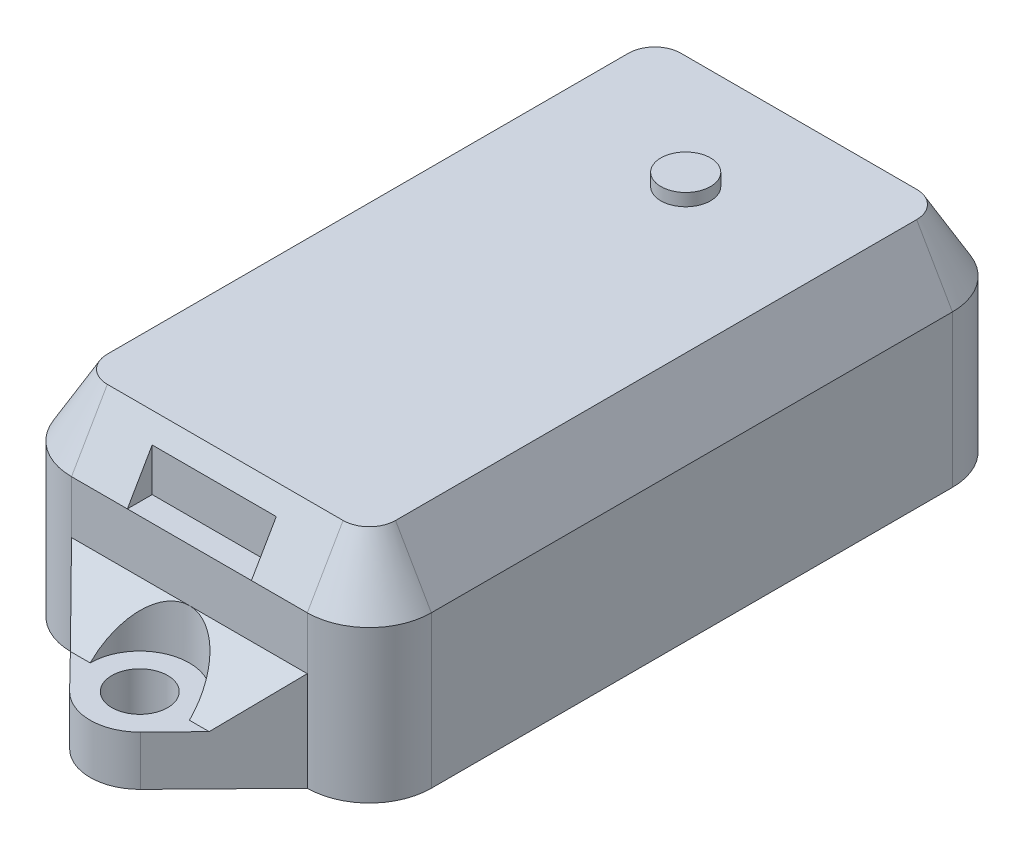
ISO-10303-21;
HEADER;
FILE_DESCRIPTION(('STEP AP214'),'2;1');
FILE_NAME('part.step','',(''),(''),'','','');
FILE_SCHEMA(('AUTOMOTIVE_DESIGN { 1 0 10303 214 1 1 1 1 }'));
ENDSEC;
DATA;
#1=APPLICATION_CONTEXT('core data for automotive mechanical design processes');
#2=APPLICATION_PROTOCOL_DEFINITION('international standard','automotive_design',2000,#1);
#3=PRODUCT_CONTEXT('',#1,'mechanical');
#4=PRODUCT('Part','Part','',(#3));
#5=PRODUCT_RELATED_PRODUCT_CATEGORY('part','',(#4));
#6=PRODUCT_DEFINITION_FORMATION('','',#4);
#7=PRODUCT_DEFINITION_CONTEXT('part definition',#1,'design');
#8=PRODUCT_DEFINITION('design','',#6,#7);
#9=PRODUCT_DEFINITION_SHAPE('','',#8);
#10=(LENGTH_UNIT() NAMED_UNIT(*) SI_UNIT(.MILLI.,.METRE.));
#11=(NAMED_UNIT(*) PLANE_ANGLE_UNIT() SI_UNIT($,.RADIAN.));
#12=(NAMED_UNIT(*) SI_UNIT($,.STERADIAN.) SOLID_ANGLE_UNIT());
#13=UNCERTAINTY_MEASURE_WITH_UNIT(LENGTH_MEASURE(1.E-05),#10,'distance_accuracy_value','');
#14=(GEOMETRIC_REPRESENTATION_CONTEXT(3) GLOBAL_UNCERTAINTY_ASSIGNED_CONTEXT((#13)) GLOBAL_UNIT_ASSIGNED_CONTEXT((#10,
#11,#12)) REPRESENTATION_CONTEXT('',''));
#15=CARTESIAN_POINT('',(0.,0.,0.));
#16=DIRECTION('',(0.,0.,1.));
#17=DIRECTION('',(1.,0.,0.));
#18=AXIS2_PLACEMENT_3D('',#15,#16,#17);
#19=CARTESIAN_POINT('',(14.5,4.,4.));
#20=DIRECTION('',(0.,-1.,0.));
#21=DIRECTION('',(0.,0.,-1.));
#22=AXIS2_PLACEMENT_3D('',#19,#20,#21);
#23=CYLINDRICAL_SURFACE('',#22,2.25);
#24=CARTESIAN_POINT('',(14.5,0.,4.));
#25=DIRECTION('',(0.,1.,0.));
#26=DIRECTION('',(0.,0.,1.));
#27=AXIS2_PLACEMENT_3D('',#24,#25,#26);
#28=CIRCLE('',#27,2.25);
#29=CARTESIAN_POINT('',(14.5,0.,6.25));
#30=VERTEX_POINT('',#29);
#31=EDGE_CURVE('E358',#30,#30,#28,.T.);
#32=ORIENTED_EDGE('',*,*,#31,.F.);
#33=EDGE_LOOP('',(#32));
#34=FACE_BOUND('',#33,.T.);
#35=CARTESIAN_POINT('',(14.5,4.,4.));
#36=DIRECTION('',(0.,1.,0.));
#37=DIRECTION('',(0.,0.,1.));
#38=AXIS2_PLACEMENT_3D('',#35,#36,#37);
#39=CIRCLE('',#38,2.25);
#40=CARTESIAN_POINT('',(14.5,4.,6.25));
#41=VERTEX_POINT('',#40);
#42=EDGE_CURVE('E402',#41,#41,#39,.T.);
#43=ORIENTED_EDGE('',*,*,#42,.T.);
#44=EDGE_LOOP('',(#43));
#45=FACE_BOUND('',#44,.T.);
#46=ADVANCED_FACE('F53',(#34,#45),#23,.F.);
#47=CARTESIAN_POINT('',(24.,7.99999999999997,0.));
#48=DIRECTION('',(0.,-0.707106781186548,-0.707106781186548));
#49=DIRECTION('',(0.,0.707106781186548,-0.707106781186548));
#50=AXIS2_PLACEMENT_3D('',#47,#48,#49);
#51=PLANE('',#50);
#52=CARTESIAN_POINT('',(14.5,3.99999999999997,4.));
#53=DIRECTION('',(0.,-0.707106781186548,-0.707106781186548));
#54=DIRECTION('',(0.,-0.707106781186548,0.707106781186548));
#55=AXIS2_PLACEMENT_3D('',#52,#53,#54);
#56=ELLIPSE('',#55,5.65685424949238,4.);
#57=CARTESIAN_POINT('',(18.5,4.,3.99999999999997));
#58=VERTEX_POINT('',#57);
#59=CARTESIAN_POINT('',(14.5,7.99999999999997,0.));
#60=VERTEX_POINT('',#59);
#61=EDGE_CURVE('E384',#58,#60,#56,.F.);
#62=ORIENTED_EDGE('',*,*,#61,.F.);
#63=DIRECTION('',(1.,0.,0.));
#64=VECTOR('',#63,1.);
#65=CARTESIAN_POINT('',(16.75,4.,4.));
#66=LINE('',#65,#64);
#67=CARTESIAN_POINT('',(20.0921052631579,3.99999999999997,4.));
#68=VERTEX_POINT('',#67);
#69=EDGE_CURVE('E398',#58,#68,#66,.T.);
#70=ORIENTED_EDGE('',*,*,#69,.T.);
#71=DIRECTION('',(0.568384879932056,0.581781156563455,-0.581781156563455));
#72=VECTOR('',#71,1.);
#73=CARTESIAN_POINT('',(14.9238246270707,-1.2900919642105,9.29009196421047));
#74=LINE('',#73,#72);
#75=CARTESIAN_POINT('',(24.,8.,0.));
#76=VERTEX_POINT('',#75);
#77=EDGE_CURVE('E547',#68,#76,#74,.T.);
#78=ORIENTED_EDGE('',*,*,#77,.T.);
#79=DIRECTION('',(-1.,0.,0.));
#80=VECTOR('',#79,1.);
#81=CARTESIAN_POINT('',(24.,8.,0.));
#82=LINE('',#81,#80);
#83=EDGE_CURVE('E551',#76,#60,#82,.T.);
#84=ORIENTED_EDGE('',*,*,#83,.T.);
#85=EDGE_LOOP('',(#62,#70,#78,#84));
#86=FACE_BOUND('',#85,.T.);
#87=ADVANCED_FACE('F562',(#86),#51,.F.);
#88=CARTESIAN_POINT('',(10.5,4.,3.99999999999997));
#89=VERTEX_POINT('',#88);
#90=EDGE_CURVE('E948',#60,#89,#56,.F.);
#91=ORIENTED_EDGE('',*,*,#90,.F.);
#92=CARTESIAN_POINT('',(5.00000000000006,7.99999999999997,0.));
#93=VERTEX_POINT('',#92);
#94=EDGE_CURVE('E546',#60,#93,#82,.T.);
#95=ORIENTED_EDGE('',*,*,#94,.T.);
#96=DIRECTION('',(-0.568384879932056,0.581781156563455,-0.581781156563455));
#97=VECTOR('',#96,1.);
#98=CARTESIAN_POINT('',(4.70739559260333,8.29950080757101,-0.299500807571039));
#99=LINE('',#98,#97);
#100=CARTESIAN_POINT('',(8.90789473684214,3.99999999999997,4.));
#101=VERTEX_POINT('',#100);
#102=EDGE_CURVE('E542',#101,#93,#99,.T.);
#103=ORIENTED_EDGE('',*,*,#102,.F.);
#104=DIRECTION('',(1.,0.,0.));
#105=VECTOR('',#104,1.);
#106=CARTESIAN_POINT('',(8.90789473684214,4.,4.00000000000001));
#107=LINE('',#106,#105);
#108=EDGE_CURVE('E392',#101,#89,#107,.T.);
#109=ORIENTED_EDGE('',*,*,#108,.T.);
#110=EDGE_LOOP('',(#91,#95,#103,#109));
#111=FACE_BOUND('',#110,.T.);
#112=ADVANCED_FACE('F657',(#111),#51,.F.);
#113=CARTESIAN_POINT('',(14.5,4.,-56.));
#114=DIRECTION('',(0.,-1.,0.));
#115=DIRECTION('',(0.,0.,-1.));
#116=AXIS2_PLACEMENT_3D('',#113,#114,#115);
#117=CYLINDRICAL_SURFACE('',#116,2.25);
#118=CARTESIAN_POINT('',(14.5,0.,-56.));
#119=DIRECTION('',(0.,1.,0.));
#120=DIRECTION('',(0.,0.,1.));
#121=AXIS2_PLACEMENT_3D('',#118,#119,#120);
#122=CIRCLE('',#121,2.25);
#123=CARTESIAN_POINT('',(14.5,0.,-53.75));
#124=VERTEX_POINT('',#123);
#125=EDGE_CURVE('E451',#124,#124,#122,.F.);
#126=ORIENTED_EDGE('',*,*,#125,.T.);
#127=EDGE_LOOP('',(#126));
#128=FACE_BOUND('',#127,.T.);
#129=CARTESIAN_POINT('',(14.5,4.,-56.));
#130=DIRECTION('',(0.,1.,0.));
#131=DIRECTION('',(0.,0.,1.));
#132=AXIS2_PLACEMENT_3D('',#129,#130,#131);
#133=CIRCLE('',#132,2.25);
#134=CARTESIAN_POINT('',(14.5,4.,-53.75));
#135=VERTEX_POINT('',#134);
#136=EDGE_CURVE('E456',#135,#135,#133,.F.);
#137=ORIENTED_EDGE('',*,*,#136,.F.);
#138=EDGE_LOOP('',(#137));
#139=FACE_BOUND('',#138,.T.);
#140=ADVANCED_FACE('F667',(#128,#139),#117,.F.);
#141=CARTESIAN_POINT('',(0.,17.25,0.));
#142=DIRECTION('',(0.,0.,-1.));
#143=DIRECTION('',(-1.,0.,0.));
#144=AXIS2_PLACEMENT_3D('',#141,#142,#143);
#145=PLANE('',#144);
#146=ORIENTED_EDGE('',*,*,#94,.F.);
#147=ORIENTED_EDGE('',*,*,#83,.F.);
#148=DIRECTION('',(0.,-1.,0.));
#149=VECTOR('',#148,1.);
#150=CARTESIAN_POINT('',(24.,17.25,0.));
#151=LINE('',#150,#149);
#152=CARTESIAN_POINT('',(24.,12.25,0.));
#153=VERTEX_POINT('',#152);
#154=EDGE_CURVE('E505',#153,#76,#151,.T.);
#155=ORIENTED_EDGE('',*,*,#154,.F.);
#156=DIRECTION('',(-1.,0.,0.));
#157=VECTOR('',#156,1.);
#158=CARTESIAN_POINT('',(5.00000000000004,12.25,0.));
#159=LINE('',#158,#157);
#160=CARTESIAN_POINT('',(19.5,12.25,0.));
#161=VERTEX_POINT('',#160);
#162=EDGE_CURVE('E307',#153,#161,#159,.T.);
#163=ORIENTED_EDGE('',*,*,#162,.T.);
#164=DIRECTION('',(1.,0.,0.));
#165=VECTOR('',#164,1.);
#166=CARTESIAN_POINT('',(9.50000000000004,12.25,0.));
#167=LINE('',#166,#165);
#168=CARTESIAN_POINT('',(9.50000000000004,12.25,0.));
#169=VERTEX_POINT('',#168);
#170=EDGE_CURVE('E597',#169,#161,#167,.T.);
#171=ORIENTED_EDGE('',*,*,#170,.F.);
#172=CARTESIAN_POINT('',(5.00000000000004,12.25,0.));
#173=VERTEX_POINT('',#172);
#174=EDGE_CURVE('E306',#169,#173,#159,.T.);
#175=ORIENTED_EDGE('',*,*,#174,.T.);
#176=DIRECTION('',(0.,-1.,0.));
#177=VECTOR('',#176,1.);
#178=CARTESIAN_POINT('',(5.00000000000004,17.25,0.));
#179=LINE('',#178,#177);
#180=EDGE_CURVE('E509',#173,#93,#179,.T.);
#181=ORIENTED_EDGE('',*,*,#180,.T.);
#182=EDGE_LOOP('',(#146,#147,#155,#163,#171,#175,#181));
#183=FACE_BOUND('',#182,.T.);
#184=ADVANCED_FACE('F569',(#183),#145,.F.);
#185=CARTESIAN_POINT('',(0.,4.,0.));
#186=DIRECTION('',(0.,1.,0.));
#187=DIRECTION('',(0.,0.,1.));
#188=AXIS2_PLACEMENT_3D('',#185,#186,#187);
#189=PLANE('',#188);
#190=ORIENTED_EDGE('',*,*,#42,.F.);
#191=EDGE_LOOP('',(#190));
#192=FACE_BOUND('',#191,.T.);
#193=CARTESIAN_POINT('',(14.5,4.,4.));
#194=DIRECTION('',(0.,1.,0.));
#195=DIRECTION('',(0.,0.,1.));
#196=AXIS2_PLACEMENT_3D('',#193,#194,#195);
#197=CIRCLE('',#196,4.);
#198=EDGE_CURVE('E946',#58,#89,#197,.T.);
#199=ORIENTED_EDGE('',*,*,#198,.T.);
#200=ORIENTED_EDGE('',*,*,#108,.F.);
#201=DIRECTION('',(0.698823529411763,0.,0.715294117647061));
#202=VECTOR('',#201,1.);
#203=CARTESIAN_POINT('',(2.55822837370245,4.,-2.49932179930798));
#204=LINE('',#203,#202);
#205=CARTESIAN_POINT('',(11.6388235294118,4.,6.79529411764705));
#206=VERTEX_POINT('',#205);
#207=EDGE_CURVE('E406',#101,#206,#204,.T.);
#208=ORIENTED_EDGE('',*,*,#207,.T.);
#209=CARTESIAN_POINT('',(14.5,4.,4.));
#210=DIRECTION('',(0.,1.,0.));
#211=DIRECTION('',(0.,0.,1.));
#212=AXIS2_PLACEMENT_3D('',#209,#210,#211);
#213=CIRCLE('',#212,4.);
#214=CARTESIAN_POINT('',(17.3611764705882,4.,6.79529411764706));
#215=VERTEX_POINT('',#214);
#216=EDGE_CURVE('E410',#206,#215,#213,.T.);
#217=ORIENTED_EDGE('',*,*,#216,.T.);
#218=DIRECTION('',(-0.698823529411763,0.,0.715294117647061));
#219=VECTOR('',#218,1.);
#220=CARTESIAN_POINT('',(12.2794961937717,4.,11.9967446366782));
#221=LINE('',#220,#219);
#222=EDGE_CURVE('E414',#68,#215,#221,.T.);
#223=ORIENTED_EDGE('',*,*,#222,.F.);
#224=ORIENTED_EDGE('',*,*,#69,.F.);
#225=EDGE_LOOP('',(#199,#200,#208,#217,#223,#224));
#226=FACE_BOUND('',#225,.T.);
#227=ADVANCED_FACE('F722',(#192,#226),#189,.T.);
#228=CARTESIAN_POINT('',(29.,17.25,0.));
#229=DIRECTION('',(-1.,0.,0.));
#230=DIRECTION('',(0.,0.,1.));
#231=AXIS2_PLACEMENT_3D('',#228,#229,#230);
#232=PLANE('',#231);
#233=DIRECTION('',(0.,-1.,0.));
#234=VECTOR('',#233,1.);
#235=CARTESIAN_POINT('',(29.,17.25,-47.));
#236=LINE('',#235,#234);
#237=CARTESIAN_POINT('',(29.,12.25,-47.));
#238=VERTEX_POINT('',#237);
#239=CARTESIAN_POINT('',(29.,0.,-47.));
#240=VERTEX_POINT('',#239);
#241=EDGE_CURVE('E266',#238,#240,#236,.T.);
#242=ORIENTED_EDGE('',*,*,#241,.F.);
#243=DIRECTION('',(0.,0.,1.));
#244=VECTOR('',#243,1.);
#245=CARTESIAN_POINT('',(29.,12.25,-5.00000000000004));
#246=LINE('',#245,#244);
#247=CARTESIAN_POINT('',(29.,12.25,-5.00000000000004));
#248=VERTEX_POINT('',#247);
#249=EDGE_CURVE('E325',#238,#248,#246,.T.);
#250=ORIENTED_EDGE('',*,*,#249,.T.);
#251=DIRECTION('',(0.,-1.,0.));
#252=VECTOR('',#251,1.);
#253=CARTESIAN_POINT('',(29.,17.25,-5.00000000000004));
#254=LINE('',#253,#252);
#255=CARTESIAN_POINT('',(29.,0.,-5.00000000000004));
#256=VERTEX_POINT('',#255);
#257=EDGE_CURVE('E502',#248,#256,#254,.T.);
#258=ORIENTED_EDGE('',*,*,#257,.T.);
#259=DIRECTION('',(0.,0.,-1.));
#260=VECTOR('',#259,1.);
#261=CARTESIAN_POINT('',(29.,0.,0.));
#262=LINE('',#261,#260);
#263=EDGE_CURVE('E481',#256,#240,#262,.T.);
#264=ORIENTED_EDGE('',*,*,#263,.T.);
#265=EDGE_LOOP('',(#242,#250,#258,#264));
#266=FACE_BOUND('',#265,.T.);
#267=ADVANCED_FACE('F726',(#266),#232,.F.);
#268=CARTESIAN_POINT('',(24.,17.25,-47.));
#269=DIRECTION('',(0.,-1.,0.));
#270=DIRECTION('',(0.,0.,-1.));
#271=AXIS2_PLACEMENT_3D('',#268,#269,#270);
#272=CYLINDRICAL_SURFACE('',#271,5.);
#273=DIRECTION('',(0.,-1.,0.));
#274=VECTOR('',#273,1.);
#275=CARTESIAN_POINT('',(24.,17.25,-52.));
#276=LINE('',#275,#274);
#277=CARTESIAN_POINT('',(24.,12.25,-52.));
#278=VERTEX_POINT('',#277);
#279=CARTESIAN_POINT('',(24.,8.,-52.));
#280=VERTEX_POINT('',#279);
#281=EDGE_CURVE('E253',#278,#280,#276,.T.);
#282=ORIENTED_EDGE('',*,*,#281,.F.);
#283=CARTESIAN_POINT('',(24.,12.25,-47.));
#284=DIRECTION('',(0.,1.,0.));
#285=DIRECTION('',(0.,0.,1.));
#286=AXIS2_PLACEMENT_3D('',#283,#284,#285);
#287=CIRCLE('',#286,5.);
#288=EDGE_CURVE('E322',#278,#238,#287,.F.);
#289=ORIENTED_EDGE('',*,*,#288,.T.);
#290=ORIENTED_EDGE('',*,*,#241,.T.);
#291=CARTESIAN_POINT('',(24.,0.,-47.));
#292=DIRECTION('',(0.,1.,0.));
#293=DIRECTION('',(0.,0.,1.));
#294=AXIS2_PLACEMENT_3D('',#291,#292,#293);
#295=CIRCLE('',#294,5.);
#296=CARTESIAN_POINT('',(24.,0.,-52.));
#297=VERTEX_POINT('',#296);
#298=EDGE_CURVE('E256',#297,#240,#295,.F.);
#299=ORIENTED_EDGE('',*,*,#298,.F.);
#300=DIRECTION('',(0.,-1.,0.));
#301=VECTOR('',#300,1.);
#302=CARTESIAN_POINT('',(24.,4.,-52.));
#303=LINE('',#302,#301);
#304=EDGE_CURVE('E243',#280,#297,#303,.T.);
#305=ORIENTED_EDGE('',*,*,#304,.F.);
#306=EDGE_LOOP('',(#282,#289,#290,#299,#305));
#307=FACE_BOUND('',#306,.T.);
#308=ADVANCED_FACE('F252',(#307),#272,.T.);
#309=CARTESIAN_POINT('',(0.,17.25,-52.));
#310=DIRECTION('',(0.,0.,-1.));
#311=DIRECTION('',(-1.,0.,0.));
#312=AXIS2_PLACEMENT_3D('',#309,#310,#311);
#313=PLANE('',#312);
#314=DIRECTION('',(1.,0.,0.));
#315=VECTOR('',#314,1.);
#316=CARTESIAN_POINT('',(0.,12.25,-52.));
#317=LINE('',#316,#315);
#318=CARTESIAN_POINT('',(5.00000000000004,12.25,-52.));
#319=VERTEX_POINT('',#318);
#320=EDGE_CURVE('E264',#319,#278,#317,.T.);
#321=ORIENTED_EDGE('',*,*,#320,.T.);
#322=ORIENTED_EDGE('',*,*,#281,.T.);
#323=DIRECTION('',(-1.,0.,0.));
#324=VECTOR('',#323,1.);
#325=CARTESIAN_POINT('',(24.,8.,-52.));
#326=LINE('',#325,#324);
#327=CARTESIAN_POINT('',(14.5,8.,-52.));
#328=VERTEX_POINT('',#327);
#329=EDGE_CURVE('E225',#280,#328,#326,.T.);
#330=ORIENTED_EDGE('',*,*,#329,.T.);
#331=CARTESIAN_POINT('',(5.00000000000006,8.,-52.));
#332=VERTEX_POINT('',#331);
#333=EDGE_CURVE('E235',#328,#332,#326,.T.);
#334=ORIENTED_EDGE('',*,*,#333,.T.);
#335=DIRECTION('',(0.,-1.,0.));
#336=VECTOR('',#335,1.);
#337=CARTESIAN_POINT('',(5.00000000000004,17.25,-52.));
#338=LINE('',#337,#336);
#339=EDGE_CURVE('E267',#319,#332,#338,.T.);
#340=ORIENTED_EDGE('',*,*,#339,.F.);
#341=EDGE_LOOP('',(#321,#322,#330,#334,#340));
#342=FACE_BOUND('',#341,.T.);
#343=ADVANCED_FACE('F261',(#342),#313,.T.);
#344=CARTESIAN_POINT('',(5.,17.25,-47.));
#345=DIRECTION('',(0.,-1.,0.));
#346=DIRECTION('',(0.,0.,-1.));
#347=AXIS2_PLACEMENT_3D('',#344,#345,#346);
#348=CYLINDRICAL_SURFACE('',#347,5.);
#349=DIRECTION('',(0.,-1.,0.));
#350=VECTOR('',#349,1.);
#351=CARTESIAN_POINT('',(0.,17.25,-47.));
#352=LINE('',#351,#350);
#353=CARTESIAN_POINT('',(0.,12.25,-47.));
#354=VERTEX_POINT('',#353);
#355=CARTESIAN_POINT('',(0.,0.,-47.));
#356=VERTEX_POINT('',#355);
#357=EDGE_CURVE('E274',#354,#356,#352,.T.);
#358=ORIENTED_EDGE('',*,*,#357,.F.);
#359=CARTESIAN_POINT('',(5.,12.25,-47.));
#360=DIRECTION('',(0.,1.,0.));
#361=DIRECTION('',(0.,0.,1.));
#362=AXIS2_PLACEMENT_3D('',#359,#360,#361);
#363=CIRCLE('',#362,5.);
#364=EDGE_CURVE('E317',#354,#319,#363,.F.);
#365=ORIENTED_EDGE('',*,*,#364,.T.);
#366=ORIENTED_EDGE('',*,*,#339,.T.);
#367=DIRECTION('',(0.,-1.,0.));
#368=VECTOR('',#367,1.);
#369=CARTESIAN_POINT('',(5.00000000000004,4.,-52.));
#370=LINE('',#369,#368);
#371=CARTESIAN_POINT('',(5.00000000000004,0.,-52.));
#372=VERTEX_POINT('',#371);
#373=EDGE_CURVE('E258',#332,#372,#370,.T.);
#374=ORIENTED_EDGE('',*,*,#373,.T.);
#375=CARTESIAN_POINT('',(5.,0.,-47.));
#376=DIRECTION('',(0.,1.,0.));
#377=DIRECTION('',(0.,0.,1.));
#378=AXIS2_PLACEMENT_3D('',#375,#376,#377);
#379=CIRCLE('',#378,5.);
#380=EDGE_CURVE('E487',#356,#372,#379,.F.);
#381=ORIENTED_EDGE('',*,*,#380,.F.);
#382=EDGE_LOOP('',(#358,#365,#366,#374,#381));
#383=FACE_BOUND('',#382,.T.);
#384=ADVANCED_FACE('F525',(#383),#348,.T.);
#385=CARTESIAN_POINT('',(0.,17.25,0.));
#386=DIRECTION('',(-1.,0.,0.));
#387=DIRECTION('',(0.,0.,1.));
#388=AXIS2_PLACEMENT_3D('',#385,#386,#387);
#389=PLANE('',#388);
#390=DIRECTION('',(0.,-1.,0.));
#391=VECTOR('',#390,1.);
#392=CARTESIAN_POINT('',(0.,17.25,-5.00000000000004));
#393=LINE('',#392,#391);
#394=CARTESIAN_POINT('',(0.,12.25,-5.00000000000004));
#395=VERTEX_POINT('',#394);
#396=CARTESIAN_POINT('',(0.,0.,-5.00000000000004));
#397=VERTEX_POINT('',#396);
#398=EDGE_CURVE('E513',#395,#397,#393,.T.);
#399=ORIENTED_EDGE('',*,*,#398,.F.);
#400=DIRECTION('',(0.,0.,-1.));
#401=VECTOR('',#400,1.);
#402=CARTESIAN_POINT('',(0.,12.25,0.));
#403=LINE('',#402,#401);
#404=EDGE_CURVE('E314',#395,#354,#403,.T.);
#405=ORIENTED_EDGE('',*,*,#404,.T.);
#406=ORIENTED_EDGE('',*,*,#357,.T.);
#407=DIRECTION('',(0.,0.,-1.));
#408=VECTOR('',#407,1.);
#409=CARTESIAN_POINT('',(0.,0.,0.));
#410=LINE('',#409,#408);
#411=EDGE_CURVE('E491',#397,#356,#410,.T.);
#412=ORIENTED_EDGE('',*,*,#411,.F.);
#413=EDGE_LOOP('',(#399,#405,#406,#412));
#414=FACE_BOUND('',#413,.T.);
#415=ADVANCED_FACE('F521',(#414),#389,.T.);
#416=CARTESIAN_POINT('',(5.,17.25,-5.));
#417=DIRECTION('',(0.,-1.,0.));
#418=DIRECTION('',(0.,0.,-1.));
#419=AXIS2_PLACEMENT_3D('',#416,#417,#418);
#420=CYLINDRICAL_SURFACE('',#419,5.);
#421=ORIENTED_EDGE('',*,*,#180,.F.);
#422=CARTESIAN_POINT('',(5.,12.25,-5.));
#423=DIRECTION('',(0.,1.,0.));
#424=DIRECTION('',(0.,0.,1.));
#425=AXIS2_PLACEMENT_3D('',#422,#423,#424);
#426=CIRCLE('',#425,5.);
#427=EDGE_CURVE('E311',#173,#395,#426,.F.);
#428=ORIENTED_EDGE('',*,*,#427,.T.);
#429=ORIENTED_EDGE('',*,*,#398,.T.);
#430=CARTESIAN_POINT('',(5.,0.,-5.));
#431=DIRECTION('',(0.,1.,0.));
#432=DIRECTION('',(0.,0.,1.));
#433=AXIS2_PLACEMENT_3D('',#430,#431,#432);
#434=CIRCLE('',#433,5.);
#435=CARTESIAN_POINT('',(5.00000000000004,0.,0.));
#436=VERTEX_POINT('',#435);
#437=EDGE_CURVE('E495',#397,#436,#434,.T.);
#438=ORIENTED_EDGE('',*,*,#437,.T.);
#439=DIRECTION('',(0.,-1.,0.));
#440=VECTOR('',#439,1.);
#441=CARTESIAN_POINT('',(5.00000000000004,4.,0.));
#442=LINE('',#441,#440);
#443=EDGE_CURVE('E417',#93,#436,#442,.T.);
#444=ORIENTED_EDGE('',*,*,#443,.F.);
#445=EDGE_LOOP('',(#421,#428,#429,#438,#444));
#446=FACE_BOUND('',#445,.T.);
#447=ADVANCED_FACE('F536',(#446),#420,.T.);
#448=CARTESIAN_POINT('',(24.,17.25,-5.));
#449=DIRECTION('',(0.,-1.,0.));
#450=DIRECTION('',(0.,0.,-1.));
#451=AXIS2_PLACEMENT_3D('',#448,#449,#450);
#452=CYLINDRICAL_SURFACE('',#451,5.);
#453=ORIENTED_EDGE('',*,*,#257,.F.);
#454=CARTESIAN_POINT('',(24.,12.25,-5.));
#455=DIRECTION('',(0.,1.,0.));
#456=DIRECTION('',(0.,0.,1.));
#457=AXIS2_PLACEMENT_3D('',#454,#455,#456);
#458=CIRCLE('',#457,5.);
#459=EDGE_CURVE('E302',#248,#153,#458,.F.);
#460=ORIENTED_EDGE('',*,*,#459,.T.);
#461=ORIENTED_EDGE('',*,*,#154,.T.);
#462=DIRECTION('',(0.,-1.,0.));
#463=VECTOR('',#462,1.);
#464=CARTESIAN_POINT('',(24.,4.,0.));
#465=LINE('',#464,#463);
#466=CARTESIAN_POINT('',(24.,0.,0.));
#467=VERTEX_POINT('',#466);
#468=EDGE_CURVE('E435',#76,#467,#465,.T.);
#469=ORIENTED_EDGE('',*,*,#468,.T.);
#470=CARTESIAN_POINT('',(24.,0.,-5.));
#471=DIRECTION('',(0.,1.,0.));
#472=DIRECTION('',(0.,0.,1.));
#473=AXIS2_PLACEMENT_3D('',#470,#471,#472);
#474=CIRCLE('',#473,5.);
#475=EDGE_CURVE('E498',#467,#256,#474,.T.);
#476=ORIENTED_EDGE('',*,*,#475,.T.);
#477=EDGE_LOOP('',(#453,#460,#461,#469,#476));
#478=FACE_BOUND('',#477,.T.);
#479=ADVANCED_FACE('F572',(#478),#452,.T.);
#480=CARTESIAN_POINT('',(0.,17.25,0.));
#481=DIRECTION('',(0.,1.,0.));
#482=DIRECTION('',(0.,0.,1.));
#483=AXIS2_PLACEMENT_3D('',#480,#481,#482);
#484=PLANE('',#483);
#485=CARTESIAN_POINT('',(14.5,17.25,-40.));
#486=DIRECTION('',(0.,1.,0.));
#487=DIRECTION('',(0.,0.,1.));
#488=AXIS2_PLACEMENT_3D('',#485,#486,#487);
#489=CIRCLE('',#488,2.00000000000001);
#490=CARTESIAN_POINT('',(14.5,17.25,-38.));
#491=VERTEX_POINT('',#490);
#492=EDGE_CURVE('E383',#491,#491,#489,.T.);
#493=ORIENTED_EDGE('',*,*,#492,.F.);
#494=EDGE_LOOP('',(#493));
#495=FACE_BOUND('',#494,.T.);
#496=DIRECTION('',(1.,0.,0.));
#497=VECTOR('',#496,1.);
#498=CARTESIAN_POINT('',(24.,17.25,-2.88675134594812));
#499=LINE('',#498,#497);
#500=CARTESIAN_POINT('',(5.00000000000004,17.25,-2.88675134594812));
#501=VERTEX_POINT('',#500);
#502=CARTESIAN_POINT('',(24.,17.25,-2.88675134594812));
#503=VERTEX_POINT('',#502);
#504=EDGE_CURVE('E295',#501,#503,#499,.T.);
#505=ORIENTED_EDGE('',*,*,#504,.T.);
#506=CARTESIAN_POINT('',(24.,17.25,-5.));
#507=DIRECTION('',(0.,1.,0.));
#508=DIRECTION('',(0.,0.,1.));
#509=AXIS2_PLACEMENT_3D('',#506,#507,#508);
#510=CIRCLE('',#509,2.11324865405188);
#511=CARTESIAN_POINT('',(26.1132486540519,17.25,-5.00000000000002));
#512=VERTEX_POINT('',#511);
#513=EDGE_CURVE('E298',#503,#512,#510,.T.);
#514=ORIENTED_EDGE('',*,*,#513,.T.);
#515=DIRECTION('',(0.,0.,-1.));
#516=VECTOR('',#515,1.);
#517=CARTESIAN_POINT('',(26.1132486540519,17.25,-47.));
#518=LINE('',#517,#516);
#519=CARTESIAN_POINT('',(26.1132486540519,17.25,-47.));
#520=VERTEX_POINT('',#519);
#521=EDGE_CURVE('E271',#512,#520,#518,.T.);
#522=ORIENTED_EDGE('',*,*,#521,.T.);
#523=CARTESIAN_POINT('',(24.,17.25,-47.));
#524=DIRECTION('',(0.,1.,0.));
#525=DIRECTION('',(0.,0.,1.));
#526=AXIS2_PLACEMENT_3D('',#523,#524,#525);
#527=CIRCLE('',#526,2.11324865405189);
#528=CARTESIAN_POINT('',(24.,17.25,-49.1132486540519));
#529=VERTEX_POINT('',#528);
#530=EDGE_CURVE('E280',#520,#529,#527,.T.);
#531=ORIENTED_EDGE('',*,*,#530,.T.);
#532=DIRECTION('',(-1.,0.,0.));
#533=VECTOR('',#532,1.);
#534=CARTESIAN_POINT('',(0.,17.25,-49.1132486540519));
#535=LINE('',#534,#533);
#536=CARTESIAN_POINT('',(5.00000000000002,17.25,-49.1132486540519));
#537=VERTEX_POINT('',#536);
#538=EDGE_CURVE('E283',#529,#537,#535,.T.);
#539=ORIENTED_EDGE('',*,*,#538,.T.);
#540=CARTESIAN_POINT('',(5.,17.25,-47.));
#541=DIRECTION('',(0.,1.,0.));
#542=DIRECTION('',(0.,0.,1.));
#543=AXIS2_PLACEMENT_3D('',#540,#541,#542);
#544=CIRCLE('',#543,2.11324865405188);
#545=CARTESIAN_POINT('',(2.88675134594811,17.25,-47.));
#546=VERTEX_POINT('',#545);
#547=EDGE_CURVE('E286',#537,#546,#544,.T.);
#548=ORIENTED_EDGE('',*,*,#547,.T.);
#549=DIRECTION('',(0.,0.,1.));
#550=VECTOR('',#549,1.);
#551=CARTESIAN_POINT('',(2.88675134594812,17.25,0.));
#552=LINE('',#551,#550);
#553=CARTESIAN_POINT('',(2.88675134594812,17.25,-5.00000000000002));
#554=VERTEX_POINT('',#553);
#555=EDGE_CURVE('E289',#546,#554,#552,.T.);
#556=ORIENTED_EDGE('',*,*,#555,.T.);
#557=CARTESIAN_POINT('',(5.,17.25,-5.));
#558=DIRECTION('',(0.,1.,0.));
#559=DIRECTION('',(0.,0.,1.));
#560=AXIS2_PLACEMENT_3D('',#557,#558,#559);
#561=CIRCLE('',#560,2.11324865405188);
#562=EDGE_CURVE('E292',#554,#501,#561,.T.);
#563=ORIENTED_EDGE('',*,*,#562,.T.);
#564=EDGE_LOOP('',(#505,#514,#522,#531,#539,#548,#556,#563));
#565=FACE_BOUND('',#564,.T.);
#566=ADVANCED_FACE('F588',(#495,#565),#484,.T.);
#567=CARTESIAN_POINT('',(0.,0.,0.));
#568=DIRECTION('',(0.,1.,0.));
#569=DIRECTION('',(0.,0.,1.));
#570=AXIS2_PLACEMENT_3D('',#567,#568,#569);
#571=PLANE('',#570);
#572=ORIENTED_EDGE('',*,*,#263,.F.);
#573=ORIENTED_EDGE('',*,*,#475,.F.);
#574=DIRECTION('',(-0.698823529411763,0.,0.715294117647061));
#575=VECTOR('',#574,1.);
#576=CARTESIAN_POINT('',(12.2794961937717,0.,11.9967446366782));
#577=LINE('',#576,#575);
#578=CARTESIAN_POINT('',(17.3611764705882,0.,6.79529411764706));
#579=VERTEX_POINT('',#578);
#580=EDGE_CURVE('E407',#467,#579,#577,.T.);
#581=ORIENTED_EDGE('',*,*,#580,.T.);
#582=CARTESIAN_POINT('',(14.5,0.,4.));
#583=DIRECTION('',(0.,1.,0.));
#584=DIRECTION('',(0.,0.,1.));
#585=AXIS2_PLACEMENT_3D('',#582,#583,#584);
#586=CIRCLE('',#585,4.);
#587=CARTESIAN_POINT('',(11.6388235294118,0.,6.79529411764705));
#588=VERTEX_POINT('',#587);
#589=EDGE_CURVE('E425',#588,#579,#586,.T.);
#590=ORIENTED_EDGE('',*,*,#589,.F.);
#591=DIRECTION('',(0.698823529411763,0.,0.715294117647061));
#592=VECTOR('',#591,1.);
#593=CARTESIAN_POINT('',(2.55822837370245,0.,-2.49932179930798));
#594=LINE('',#593,#592);
#595=EDGE_CURVE('E421',#436,#588,#594,.T.);
#596=ORIENTED_EDGE('',*,*,#595,.F.);
#597=ORIENTED_EDGE('',*,*,#437,.F.);
#598=ORIENTED_EDGE('',*,*,#411,.T.);
#599=ORIENTED_EDGE('',*,*,#380,.T.);
#600=DIRECTION('',(0.698823529411762,0.,-0.715294117647061));
#601=VECTOR('',#600,1.);
#602=CARTESIAN_POINT('',(-23.4347183391003,0.,-22.8951031141867));
#603=LINE('',#602,#601);
#604=CARTESIAN_POINT('',(11.6388235294118,0.,-58.7952941176471));
#605=VERTEX_POINT('',#604);
#606=EDGE_CURVE('E463',#372,#605,#603,.T.);
#607=ORIENTED_EDGE('',*,*,#606,.T.);
#608=CARTESIAN_POINT('',(14.5,0.,-56.));
#609=DIRECTION('',(0.,1.,0.));
#610=DIRECTION('',(0.,0.,1.));
#611=AXIS2_PLACEMENT_3D('',#608,#609,#610);
#612=CIRCLE('',#611,4.00000000000001);
#613=CARTESIAN_POINT('',(17.3611764705882,0.,-58.7952941176471));
#614=VERTEX_POINT('',#613);
#615=EDGE_CURVE('E446',#605,#614,#612,.F.);
#616=ORIENTED_EDGE('',*,*,#615,.T.);
#617=DIRECTION('',(-0.698823529411763,0.,-0.715294117647061));
#618=VECTOR('',#617,1.);
#619=CARTESIAN_POINT('',(38.2724429065745,0.,-37.3911695501728));
#620=LINE('',#619,#618);
#621=EDGE_CURVE('E467',#297,#614,#620,.T.);
#622=ORIENTED_EDGE('',*,*,#621,.F.);
#623=ORIENTED_EDGE('',*,*,#298,.T.);
#624=EDGE_LOOP('',(#572,#573,#581,#590,#596,#597,#598,#599,#607,#616,#622,#623));
#625=FACE_BOUND('',#624,.T.);
#626=ORIENTED_EDGE('',*,*,#125,.F.);
#627=EDGE_LOOP('',(#626));
#628=FACE_BOUND('',#627,.T.);
#629=ORIENTED_EDGE('',*,*,#31,.T.);
#630=EDGE_LOOP('',(#629));
#631=FACE_BOUND('',#630,.T.);
#632=ADVANCED_FACE('F530',(#625,#628,#631),#571,.F.);
#633=CARTESIAN_POINT('',(14.5,4.,-56.));
#634=DIRECTION('',(0.,-1.,0.));
#635=DIRECTION('',(0.,0.,-1.));
#636=AXIS2_PLACEMENT_3D('',#633,#634,#635);
#637=CYLINDRICAL_SURFACE('',#636,4.00000000000001);
#638=ORIENTED_EDGE('',*,*,#615,.F.);
#639=DIRECTION('',(0.,-1.,0.));
#640=VECTOR('',#639,1.);
#641=CARTESIAN_POINT('',(11.6388235294118,4.,-58.7952941176471));
#642=LINE('',#641,#640);
#643=CARTESIAN_POINT('',(11.6388235294118,4.,-58.7952941176471));
#644=VERTEX_POINT('',#643);
#645=EDGE_CURVE('E478',#644,#605,#642,.T.);
#646=ORIENTED_EDGE('',*,*,#645,.F.);
#647=CARTESIAN_POINT('',(14.5,4.,-56.));
#648=DIRECTION('',(0.,1.,0.));
#649=DIRECTION('',(0.,0.,1.));
#650=AXIS2_PLACEMENT_3D('',#647,#648,#649);
#651=CIRCLE('',#650,4.00000000000001);
#652=CARTESIAN_POINT('',(17.3611764705882,4.,-58.7952941176471));
#653=VERTEX_POINT('',#652);
#654=EDGE_CURVE('E447',#644,#653,#651,.F.);
#655=ORIENTED_EDGE('',*,*,#654,.T.);
#656=DIRECTION('',(0.,-1.,0.));
#657=VECTOR('',#656,1.);
#658=CARTESIAN_POINT('',(17.3611764705882,4.,-58.7952941176471));
#659=LINE('',#658,#657);
#660=EDGE_CURVE('E259',#653,#614,#659,.T.);
#661=ORIENTED_EDGE('',*,*,#660,.T.);
#662=EDGE_LOOP('',(#638,#646,#655,#661));
#663=FACE_BOUND('',#662,.T.);
#664=ADVANCED_FACE('F639',(#663),#637,.T.);
#665=CARTESIAN_POINT('',(-23.4347183391003,4.,-22.8951031141867));
#666=DIRECTION('',(-0.715294117647061,0.,-0.698823529411762));
#667=DIRECTION('',(-0.698823529411762,0.,0.715294117647061));
#668=AXIS2_PLACEMENT_3D('',#665,#666,#667);
#669=PLANE('',#668);
#670=DIRECTION('',(-0.568384879932056,0.581781156563455,0.581781156563455));
#671=VECTOR('',#670,1.);
#672=CARTESIAN_POINT('',(-12.4877362740394,25.8999051424512,-34.1000948575488));
#673=LINE('',#672,#671);
#674=CARTESIAN_POINT('',(8.90789473684212,4.,-56.));
#675=VERTEX_POINT('',#674);
#676=EDGE_CURVE('E248',#675,#332,#673,.T.);
#677=ORIENTED_EDGE('',*,*,#676,.F.);
#678=DIRECTION('',(0.698823529411762,0.,-0.715294117647061));
#679=VECTOR('',#678,1.);
#680=CARTESIAN_POINT('',(-23.4347183391003,4.,-22.8951031141867));
#681=LINE('',#680,#679);
#682=EDGE_CURVE('E389',#675,#644,#681,.T.);
#683=ORIENTED_EDGE('',*,*,#682,.T.);
#684=ORIENTED_EDGE('',*,*,#645,.T.);
#685=ORIENTED_EDGE('',*,*,#606,.F.);
#686=ORIENTED_EDGE('',*,*,#373,.F.);
#687=EDGE_LOOP('',(#677,#683,#684,#685,#686));
#688=FACE_BOUND('',#687,.T.);
#689=ADVANCED_FACE('F635',(#688),#669,.T.);
#690=CARTESIAN_POINT('',(38.2724429065745,4.,-37.3911695501728));
#691=DIRECTION('',(-0.715294117647061,0.,0.698823529411763));
#692=DIRECTION('',(0.698823529411762,0.,0.715294117647061));
#693=AXIS2_PLACEMENT_3D('',#690,#691,#692);
#694=PLANE('',#693);
#695=DIRECTION('',(-0.698823529411763,0.,-0.715294117647061));
#696=VECTOR('',#695,1.);
#697=CARTESIAN_POINT('',(38.2724429065745,4.,-37.3911695501728));
#698=LINE('',#697,#696);
#699=CARTESIAN_POINT('',(20.0921052631579,4.,-56.));
#700=VERTEX_POINT('',#699);
#701=EDGE_CURVE('E246',#700,#653,#698,.T.);
#702=ORIENTED_EDGE('',*,*,#701,.F.);
#703=DIRECTION('',(0.568384879932056,0.581781156563455,0.581781156563455));
#704=VECTOR('',#703,1.);
#705=CARTESIAN_POINT('',(32.1189564937134,16.3103123706697,-43.6896876293303));
#706=LINE('',#705,#704);
#707=EDGE_CURVE('E228',#700,#280,#706,.T.);
#708=ORIENTED_EDGE('',*,*,#707,.T.);
#709=ORIENTED_EDGE('',*,*,#304,.T.);
#710=ORIENTED_EDGE('',*,*,#621,.T.);
#711=ORIENTED_EDGE('',*,*,#660,.F.);
#712=EDGE_LOOP('',(#702,#708,#709,#710,#711));
#713=FACE_BOUND('',#712,.T.);
#714=ADVANCED_FACE('F241',(#713),#694,.F.);
#715=CARTESIAN_POINT('',(0.,4.,0.));
#716=DIRECTION('',(0.,1.,0.));
#717=DIRECTION('',(0.,0.,1.));
#718=AXIS2_PLACEMENT_3D('',#715,#716,#717);
#719=PLANE('',#718);
#720=ORIENTED_EDGE('',*,*,#136,.T.);
#721=EDGE_LOOP('',(#720));
#722=FACE_BOUND('',#721,.T.);
#723=CARTESIAN_POINT('',(14.5,4.,-56.));
#724=DIRECTION('',(0.,1.,0.));
#725=DIRECTION('',(0.,0.,1.));
#726=AXIS2_PLACEMENT_3D('',#723,#724,#725);
#727=CIRCLE('',#726,4.);
#728=CARTESIAN_POINT('',(10.5,4.,-56.));
#729=VERTEX_POINT('',#728);
#730=CARTESIAN_POINT('',(18.5,4.,-56.));
#731=VERTEX_POINT('',#730);
#732=EDGE_CURVE('E379',#729,#731,#727,.T.);
#733=ORIENTED_EDGE('',*,*,#732,.T.);
#734=DIRECTION('',(1.,0.,0.));
#735=VECTOR('',#734,1.);
#736=CARTESIAN_POINT('',(16.75,4.,-56.));
#737=LINE('',#736,#735);
#738=EDGE_CURVE('E391',#731,#700,#737,.T.);
#739=ORIENTED_EDGE('',*,*,#738,.T.);
#740=ORIENTED_EDGE('',*,*,#701,.T.);
#741=ORIENTED_EDGE('',*,*,#654,.F.);
#742=ORIENTED_EDGE('',*,*,#682,.F.);
#743=DIRECTION('',(1.,0.,0.));
#744=VECTOR('',#743,1.);
#745=CARTESIAN_POINT('',(8.90789473684212,4.,-56.));
#746=LINE('',#745,#744);
#747=EDGE_CURVE('E375',#675,#729,#746,.T.);
#748=ORIENTED_EDGE('',*,*,#747,.T.);
#749=EDGE_LOOP('',(#733,#739,#740,#741,#742,#748));
#750=FACE_BOUND('',#749,.T.);
#751=ADVANCED_FACE('F387',(#722,#750),#719,.T.);
#752=CARTESIAN_POINT('',(2.55822837370245,4.,-2.49932179930798));
#753=DIRECTION('',(0.715294117647061,0.,-0.698823529411763));
#754=DIRECTION('',(-0.698823529411763,0.,-0.715294117647061));
#755=AXIS2_PLACEMENT_3D('',#752,#753,#754);
#756=PLANE('',#755);
#757=ORIENTED_EDGE('',*,*,#207,.F.);
#758=ORIENTED_EDGE('',*,*,#102,.T.);
#759=ORIENTED_EDGE('',*,*,#443,.T.);
#760=ORIENTED_EDGE('',*,*,#595,.T.);
#761=DIRECTION('',(0.,-1.,0.));
#762=VECTOR('',#761,1.);
#763=CARTESIAN_POINT('',(11.6388235294118,4.,6.79529411764705));
#764=LINE('',#763,#762);
#765=EDGE_CURVE('E442',#206,#588,#764,.T.);
#766=ORIENTED_EDGE('',*,*,#765,.F.);
#767=EDGE_LOOP('',(#757,#758,#759,#760,#766));
#768=FACE_BOUND('',#767,.T.);
#769=ADVANCED_FACE('F540',(#768),#756,.F.);
#770=CARTESIAN_POINT('',(14.5,4.,4.));
#771=DIRECTION('',(0.,-1.,0.));
#772=DIRECTION('',(0.,0.,-1.));
#773=AXIS2_PLACEMENT_3D('',#770,#771,#772);
#774=CYLINDRICAL_SURFACE('',#773,4.);
#775=ORIENTED_EDGE('',*,*,#589,.T.);
#776=DIRECTION('',(0.,-1.,0.));
#777=VECTOR('',#776,1.);
#778=CARTESIAN_POINT('',(17.3611764705882,4.,6.79529411764706));
#779=LINE('',#778,#777);
#780=EDGE_CURVE('E439',#215,#579,#779,.T.);
#781=ORIENTED_EDGE('',*,*,#780,.F.);
#782=ORIENTED_EDGE('',*,*,#216,.F.);
#783=ORIENTED_EDGE('',*,*,#765,.T.);
#784=EDGE_LOOP('',(#775,#781,#782,#783));
#785=FACE_BOUND('',#784,.T.);
#786=ADVANCED_FACE('F748',(#785),#774,.T.);
#787=CARTESIAN_POINT('',(12.2794961937717,4.,11.9967446366782));
#788=DIRECTION('',(0.715294117647061,0.,0.698823529411763));
#789=DIRECTION('',(0.698823529411763,0.,-0.715294117647061));
#790=AXIS2_PLACEMENT_3D('',#787,#788,#789);
#791=PLANE('',#790);
#792=ORIENTED_EDGE('',*,*,#77,.F.);
#793=ORIENTED_EDGE('',*,*,#222,.T.);
#794=ORIENTED_EDGE('',*,*,#780,.T.);
#795=ORIENTED_EDGE('',*,*,#580,.F.);
#796=ORIENTED_EDGE('',*,*,#468,.F.);
#797=EDGE_LOOP('',(#792,#793,#794,#795,#796));
#798=FACE_BOUND('',#797,.T.);
#799=ADVANCED_FACE('F755',(#798),#791,.T.);
#800=CARTESIAN_POINT('',(5.,12.25,-47.));
#801=DIRECTION('',(0.,-1.,0.));
#802=DIRECTION('',(0.,0.,-1.));
#803=AXIS2_PLACEMENT_3D('',#800,#801,#802);
#804=CONICAL_SURFACE('',#803,5.,0.523598775598296);
#805=DIRECTION('',(0.,0.86602540378444,0.499999999999997));
#806=VECTOR('',#805,1.);
#807=CARTESIAN_POINT('',(5.00000000000004,12.25,-52.));
#808=LINE('',#807,#806);
#809=EDGE_CURVE('E350',#319,#537,#808,.T.);
#810=ORIENTED_EDGE('',*,*,#809,.F.);
#811=ORIENTED_EDGE('',*,*,#364,.F.);
#812=DIRECTION('',(-0.499999999999997,-0.86602540378444,0.));
#813=VECTOR('',#812,1.);
#814=CARTESIAN_POINT('',(2.88675134594811,17.25,-47.));
#815=LINE('',#814,#813);
#816=EDGE_CURVE('E354',#546,#354,#815,.T.);
#817=ORIENTED_EDGE('',*,*,#816,.F.);
#818=ORIENTED_EDGE('',*,*,#547,.F.);
#819=EDGE_LOOP('',(#810,#811,#817,#818));
#820=FACE_BOUND('',#819,.T.);
#821=ADVANCED_FACE('F56',(#820),#804,.T.);
#822=CARTESIAN_POINT('',(0.,12.25,0.));
#823=DIRECTION('',(0.86602540378444,-0.499999999999997,0.));
#824=DIRECTION('',(0.,0.,-1.));
#825=AXIS2_PLACEMENT_3D('',#822,#823,#824);
#826=PLANE('',#825);
#827=ORIENTED_EDGE('',*,*,#816,.T.);
#828=ORIENTED_EDGE('',*,*,#404,.F.);
#829=DIRECTION('',(-0.499999999999997,-0.86602540378444,0.));
#830=VECTOR('',#829,1.);
#831=CARTESIAN_POINT('',(2.88675134594812,17.25,-5.00000000000002));
#832=LINE('',#831,#830);
#833=EDGE_CURVE('E346',#554,#395,#832,.T.);
#834=ORIENTED_EDGE('',*,*,#833,.F.);
#835=ORIENTED_EDGE('',*,*,#555,.F.);
#836=EDGE_LOOP('',(#827,#828,#834,#835));
#837=FACE_BOUND('',#836,.T.);
#838=ADVANCED_FACE('F627',(#837),#826,.F.);
#839=CARTESIAN_POINT('',(0.,12.25,-52.));
#840=DIRECTION('',(0.,-0.499999999999997,0.86602540378444));
#841=DIRECTION('',(1.,0.,0.));
#842=AXIS2_PLACEMENT_3D('',#839,#840,#841);
#843=PLANE('',#842);
#844=ORIENTED_EDGE('',*,*,#809,.T.);
#845=ORIENTED_EDGE('',*,*,#538,.F.);
#846=DIRECTION('',(0.,0.86602540378444,0.499999999999997));
#847=VECTOR('',#846,1.);
#848=CARTESIAN_POINT('',(24.,12.25,-52.));
#849=LINE('',#848,#847);
#850=EDGE_CURVE('E342',#278,#529,#849,.T.);
#851=ORIENTED_EDGE('',*,*,#850,.F.);
#852=ORIENTED_EDGE('',*,*,#320,.F.);
#853=EDGE_LOOP('',(#844,#845,#851,#852));
#854=FACE_BOUND('',#853,.T.);
#855=ADVANCED_FACE('F778',(#854),#843,.F.);
#856=CARTESIAN_POINT('',(5.,17.25,-5.));
#857=DIRECTION('',(0.,-1.,0.));
#858=DIRECTION('',(0.,0.,-1.));
#859=AXIS2_PLACEMENT_3D('',#856,#857,#858);
#860=CONICAL_SURFACE('',#859,2.11324865405188,0.523598775598296);
#861=ORIENTED_EDGE('',*,*,#833,.T.);
#862=ORIENTED_EDGE('',*,*,#427,.F.);
#863=DIRECTION('',(0.,-0.86602540378444,0.499999999999997));
#864=VECTOR('',#863,1.);
#865=CARTESIAN_POINT('',(5.00000000000004,17.25,-2.88675134594812));
#866=LINE('',#865,#864);
#867=EDGE_CURVE('E338',#501,#173,#866,.T.);
#868=ORIENTED_EDGE('',*,*,#867,.F.);
#869=ORIENTED_EDGE('',*,*,#562,.F.);
#870=EDGE_LOOP('',(#861,#862,#868,#869));
#871=FACE_BOUND('',#870,.T.);
#872=ADVANCED_FACE('F624',(#871),#860,.T.);
#873=CARTESIAN_POINT('',(24.,12.25,-47.));
#874=DIRECTION('',(0.,-1.,0.));
#875=DIRECTION('',(0.,0.,-1.));
#876=AXIS2_PLACEMENT_3D('',#873,#874,#875);
#877=CONICAL_SURFACE('',#876,5.,0.523598775598295);
#878=ORIENTED_EDGE('',*,*,#850,.T.);
#879=ORIENTED_EDGE('',*,*,#530,.F.);
#880=DIRECTION('',(-0.499999999999997,0.866025403784441,0.));
#881=VECTOR('',#880,1.);
#882=CARTESIAN_POINT('',(29.,12.25,-47.));
#883=LINE('',#882,#881);
#884=EDGE_CURVE('E334',#238,#520,#883,.T.);
#885=ORIENTED_EDGE('',*,*,#884,.F.);
#886=ORIENTED_EDGE('',*,*,#288,.F.);
#887=EDGE_LOOP('',(#878,#879,#885,#886));
#888=FACE_BOUND('',#887,.T.);
#889=ADVANCED_FACE('F791',(#888),#877,.T.);
#890=CARTESIAN_POINT('',(0.,17.25,-2.88675134594812));
#891=DIRECTION('',(0.,0.499999999999997,0.86602540378444));
#892=DIRECTION('',(-1.,0.,0.));
#893=AXIS2_PLACEMENT_3D('',#890,#891,#892);
#894=PLANE('',#893);
#895=DIRECTION('',(0.,-0.86602540378444,0.499999999999997));
#896=VECTOR('',#895,1.);
#897=CARTESIAN_POINT('',(9.50000000000004,17.25,-2.88675134594812));
#898=LINE('',#897,#896);
#899=CARTESIAN_POINT('',(9.50000000000004,15.7141016151378,-2.00000000000001));
#900=VERTEX_POINT('',#899);
#901=EDGE_CURVE('E363',#900,#169,#898,.T.);
#902=ORIENTED_EDGE('',*,*,#901,.F.);
#903=DIRECTION('',(-1.,0.,0.));
#904=VECTOR('',#903,1.);
#905=CARTESIAN_POINT('',(0.,15.7141016151378,-2.00000000000001));
#906=LINE('',#905,#904);
#907=CARTESIAN_POINT('',(19.5,15.7141016151378,-2.00000000000001));
#908=VERTEX_POINT('',#907);
#909=EDGE_CURVE('E361',#908,#900,#906,.T.);
#910=ORIENTED_EDGE('',*,*,#909,.F.);
#911=DIRECTION('',(0.,0.86602540378444,-0.499999999999997));
#912=VECTOR('',#911,1.);
#913=CARTESIAN_POINT('',(19.5,17.25,-2.88675134594812));
#914=LINE('',#913,#912);
#915=EDGE_CURVE('E328',#161,#908,#914,.T.);
#916=ORIENTED_EDGE('',*,*,#915,.F.);
#917=ORIENTED_EDGE('',*,*,#162,.F.);
#918=DIRECTION('',(0.,-0.86602540378444,0.499999999999997));
#919=VECTOR('',#918,1.);
#920=CARTESIAN_POINT('',(24.,17.25,-2.88675134594812));
#921=LINE('',#920,#919);
#922=EDGE_CURVE('E331',#503,#153,#921,.T.);
#923=ORIENTED_EDGE('',*,*,#922,.F.);
#924=ORIENTED_EDGE('',*,*,#504,.F.);
#925=ORIENTED_EDGE('',*,*,#867,.T.);
#926=ORIENTED_EDGE('',*,*,#174,.F.);
#927=EDGE_LOOP('',(#902,#910,#916,#917,#923,#924,#925,#926));
#928=FACE_BOUND('',#927,.T.);
#929=ADVANCED_FACE('F593',(#928),#894,.T.);
#930=CARTESIAN_POINT('',(26.1132486540519,17.25,0.));
#931=DIRECTION('',(0.86602540378444,0.499999999999997,0.));
#932=DIRECTION('',(0.,0.,1.));
#933=AXIS2_PLACEMENT_3D('',#930,#931,#932);
#934=PLANE('',#933);
#935=ORIENTED_EDGE('',*,*,#884,.T.);
#936=ORIENTED_EDGE('',*,*,#521,.F.);
#937=DIRECTION('',(-0.499999999999997,0.86602540378444,0.));
#938=VECTOR('',#937,1.);
#939=CARTESIAN_POINT('',(29.,12.25,-5.00000000000004));
#940=LINE('',#939,#938);
#941=EDGE_CURVE('E234',#248,#512,#940,.T.);
#942=ORIENTED_EDGE('',*,*,#941,.F.);
#943=ORIENTED_EDGE('',*,*,#249,.F.);
#944=EDGE_LOOP('',(#935,#936,#942,#943));
#945=FACE_BOUND('',#944,.T.);
#946=ADVANCED_FACE('F584',(#945),#934,.T.);
#947=CARTESIAN_POINT('',(24.,17.25,-5.));
#948=DIRECTION('',(0.,-1.,0.));
#949=DIRECTION('',(0.,0.,-1.));
#950=AXIS2_PLACEMENT_3D('',#947,#948,#949);
#951=CONICAL_SURFACE('',#950,2.11324865405188,0.523598775598296);
#952=ORIENTED_EDGE('',*,*,#922,.T.);
#953=ORIENTED_EDGE('',*,*,#459,.F.);
#954=ORIENTED_EDGE('',*,*,#941,.T.);
#955=ORIENTED_EDGE('',*,*,#513,.F.);
#956=EDGE_LOOP('',(#952,#953,#954,#955));
#957=FACE_BOUND('',#956,.T.);
#958=ADVANCED_FACE('F577',(#957),#951,.T.);
#959=CARTESIAN_POINT('',(9.50000000000004,12.25,0.));
#960=DIRECTION('',(-1.,0.,0.));
#961=DIRECTION('',(0.,0.,1.));
#962=AXIS2_PLACEMENT_3D('',#959,#960,#961);
#963=PLANE('',#962);
#964=ORIENTED_EDGE('',*,*,#901,.T.);
#965=DIRECTION('',(0.,0.,1.));
#966=VECTOR('',#965,1.);
#967=CARTESIAN_POINT('',(9.50000000000004,12.25,0.));
#968=LINE('',#967,#966);
#969=CARTESIAN_POINT('',(9.50000000000004,12.25,-2.00000000000001));
#970=VERTEX_POINT('',#969);
#971=EDGE_CURVE('E76',#970,#169,#968,.T.);
#972=ORIENTED_EDGE('',*,*,#971,.F.);
#973=DIRECTION('',(0.,1.,0.));
#974=VECTOR('',#973,1.);
#975=CARTESIAN_POINT('',(9.50000000000004,12.25,-2.00000000000001));
#976=LINE('',#975,#974);
#977=EDGE_CURVE('E552',#970,#900,#976,.T.);
#978=ORIENTED_EDGE('',*,*,#977,.T.);
#979=EDGE_LOOP('',(#964,#972,#978));
#980=FACE_BOUND('',#979,.T.);
#981=ADVANCED_FACE('F816',(#980),#963,.F.);
#982=CARTESIAN_POINT('',(9.50000000000004,12.25,-2.00000000000001));
#983=DIRECTION('',(0.,0.,-1.));
#984=DIRECTION('',(-1.,0.,0.));
#985=AXIS2_PLACEMENT_3D('',#982,#983,#984);
#986=PLANE('',#985);
#987=ORIENTED_EDGE('',*,*,#909,.T.);
#988=ORIENTED_EDGE('',*,*,#977,.F.);
#989=DIRECTION('',(-1.,0.,0.));
#990=VECTOR('',#989,1.);
#991=CARTESIAN_POINT('',(9.50000000000004,12.25,-2.00000000000001));
#992=LINE('',#991,#990);
#993=CARTESIAN_POINT('',(19.5,12.25,-2.00000000000001));
#994=VERTEX_POINT('',#993);
#995=EDGE_CURVE('E605',#994,#970,#992,.T.);
#996=ORIENTED_EDGE('',*,*,#995,.F.);
#997=DIRECTION('',(0.,1.,0.));
#998=VECTOR('',#997,1.);
#999=CARTESIAN_POINT('',(19.5,12.25,-2.00000000000001));
#1000=LINE('',#999,#998);
#1001=EDGE_CURVE('E613',#994,#908,#1000,.T.);
#1002=ORIENTED_EDGE('',*,*,#1001,.T.);
#1003=EDGE_LOOP('',(#987,#988,#996,#1002));
#1004=FACE_BOUND('',#1003,.T.);
#1005=ADVANCED_FACE('F619',(#1004),#986,.F.);
#1006=CARTESIAN_POINT('',(19.5,12.25,0.));
#1007=DIRECTION('',(1.,0.,0.));
#1008=DIRECTION('',(0.,0.,-1.));
#1009=AXIS2_PLACEMENT_3D('',#1006,#1007,#1008);
#1010=PLANE('',#1009);
#1011=ORIENTED_EDGE('',*,*,#915,.T.);
#1012=ORIENTED_EDGE('',*,*,#1001,.F.);
#1013=DIRECTION('',(0.,0.,-1.));
#1014=VECTOR('',#1013,1.);
#1015=CARTESIAN_POINT('',(19.5,12.25,0.));
#1016=LINE('',#1015,#1014);
#1017=EDGE_CURVE('E601',#161,#994,#1016,.T.);
#1018=ORIENTED_EDGE('',*,*,#1017,.F.);
#1019=EDGE_LOOP('',(#1011,#1012,#1018));
#1020=FACE_BOUND('',#1019,.T.);
#1021=ADVANCED_FACE('F877',(#1020),#1010,.F.);
#1022=CARTESIAN_POINT('',(0.,12.25,0.));
#1023=DIRECTION('',(0.,-1.,0.));
#1024=DIRECTION('',(0.,0.,-1.));
#1025=AXIS2_PLACEMENT_3D('',#1022,#1023,#1024);
#1026=PLANE('',#1025);
#1027=ORIENTED_EDGE('',*,*,#971,.T.);
#1028=ORIENTED_EDGE('',*,*,#170,.T.);
#1029=ORIENTED_EDGE('',*,*,#1017,.T.);
#1030=ORIENTED_EDGE('',*,*,#995,.T.);
#1031=EDGE_LOOP('',(#1027,#1028,#1029,#1030));
#1032=FACE_BOUND('',#1031,.T.);
#1033=ADVANCED_FACE('F873',(#1032),#1026,.F.);
#1034=CARTESIAN_POINT('',(14.5,18.25,-40.));
#1035=DIRECTION('',(0.,-1.,0.));
#1036=DIRECTION('',(0.,0.,-1.));
#1037=AXIS2_PLACEMENT_3D('',#1034,#1035,#1036);
#1038=CYLINDRICAL_SURFACE('',#1037,2.00000000000001);
#1039=CARTESIAN_POINT('',(14.5,18.25,-40.));
#1040=DIRECTION('',(0.,1.,0.));
#1041=DIRECTION('',(0.,0.,1.));
#1042=AXIS2_PLACEMENT_3D('',#1039,#1040,#1041);
#1043=CIRCLE('',#1042,2.00000000000001);
#1044=CARTESIAN_POINT('',(14.5,18.25,-38.));
#1045=VERTEX_POINT('',#1044);
#1046=EDGE_CURVE('E607',#1045,#1045,#1043,.T.);
#1047=ORIENTED_EDGE('',*,*,#1046,.F.);
#1048=EDGE_LOOP('',(#1047));
#1049=FACE_BOUND('',#1048,.T.);
#1050=ORIENTED_EDGE('',*,*,#492,.T.);
#1051=EDGE_LOOP('',(#1050));
#1052=FACE_BOUND('',#1051,.T.);
#1053=ADVANCED_FACE('F876',(#1049,#1052),#1038,.T.);
#1054=CARTESIAN_POINT('',(14.5,18.25,-40.));
#1055=DIRECTION('',(0.,1.,0.));
#1056=DIRECTION('',(0.,0.,1.));
#1057=AXIS2_PLACEMENT_3D('',#1054,#1055,#1056);
#1058=PLANE('',#1057);
#1059=ORIENTED_EDGE('',*,*,#1046,.T.);
#1060=EDGE_LOOP('',(#1059));
#1061=FACE_BOUND('',#1060,.T.);
#1062=ADVANCED_FACE('F692',(#1061),#1058,.T.);
#1063=CARTESIAN_POINT('',(14.5,14.,-56.));
#1064=DIRECTION('',(0.,-1.,0.));
#1065=DIRECTION('',(0.,0.,-1.));
#1066=AXIS2_PLACEMENT_3D('',#1063,#1064,#1065);
#1067=CYLINDRICAL_SURFACE('',#1066,4.);
#1068=CARTESIAN_POINT('',(14.5,4.,-56.));
#1069=DIRECTION('',(0.,-0.707106781186548,0.707106781186547));
#1070=DIRECTION('',(0.,-0.707106781186547,-0.707106781186548));
#1071=AXIS2_PLACEMENT_3D('',#1068,#1069,#1070);
#1072=ELLIPSE('',#1071,5.65685424949238,4.);
#1073=EDGE_CURVE('E11',#731,#328,#1072,.T.);
#1074=ORIENTED_EDGE('',*,*,#1073,.F.);
#1075=ORIENTED_EDGE('',*,*,#732,.F.);
#1076=EDGE_CURVE('E58',#328,#729,#1072,.T.);
#1077=ORIENTED_EDGE('',*,*,#1076,.F.);
#1078=EDGE_LOOP('',(#1074,#1075,#1077));
#1079=FACE_BOUND('',#1078,.T.);
#1080=ADVANCED_FACE('F380',(#1079),#1067,.F.);
#1081=CARTESIAN_POINT('',(14.5,14.,4.));
#1082=DIRECTION('',(0.,-1.,0.));
#1083=DIRECTION('',(0.,0.,-1.));
#1084=AXIS2_PLACEMENT_3D('',#1081,#1082,#1083);
#1085=CYLINDRICAL_SURFACE('',#1084,4.);
#1086=ORIENTED_EDGE('',*,*,#61,.T.);
#1087=ORIENTED_EDGE('',*,*,#90,.T.);
#1088=ORIENTED_EDGE('',*,*,#198,.F.);
#1089=EDGE_LOOP('',(#1086,#1087,#1088));
#1090=FACE_BOUND('',#1089,.T.);
#1091=ADVANCED_FACE('F691',(#1090),#1085,.F.);
#1092=CARTESIAN_POINT('',(30.,4.,-56.));
#1093=DIRECTION('',(0.,-0.707106781186548,0.707106781186547));
#1094=DIRECTION('',(0.,-0.707106781186547,-0.707106781186548));
#1095=AXIS2_PLACEMENT_3D('',#1092,#1093,#1094);
#1096=PLANE('',#1095);
#1097=ORIENTED_EDGE('',*,*,#676,.T.);
#1098=ORIENTED_EDGE('',*,*,#333,.F.);
#1099=ORIENTED_EDGE('',*,*,#1076,.T.);
#1100=ORIENTED_EDGE('',*,*,#747,.F.);
#1101=EDGE_LOOP('',(#1097,#1098,#1099,#1100));
#1102=FACE_BOUND('',#1101,.T.);
#1103=ADVANCED_FACE('F373',(#1102),#1096,.F.);
#1104=ORIENTED_EDGE('',*,*,#738,.F.);
#1105=ORIENTED_EDGE('',*,*,#1073,.T.);
#1106=ORIENTED_EDGE('',*,*,#329,.F.);
#1107=ORIENTED_EDGE('',*,*,#707,.F.);
#1108=EDGE_LOOP('',(#1104,#1105,#1106,#1107));
#1109=FACE_BOUND('',#1108,.T.);
#1110=ADVANCED_FACE('F227',(#1109),#1096,.F.);
#1111=CLOSED_SHELL('',(#46,#87,#112,#140,#184,#227,#267,#308,#343,#384,#415,#447,#479,#566,#632,
#664,#689,#714,#751,#769,#786,#799,#821,#838,#855,#872,#889,#929,#946,#958,#981,#1005,#1021,
#1033,#1053,#1062,#1080,#1091,#1103,#1110));
#1112=MANIFOLD_SOLID_BREP('B2',#1111);
#1113=ADVANCED_BREP_SHAPE_REPRESENTATION('',(#18,#1112),#14);
#1114=SHAPE_DEFINITION_REPRESENTATION(#9,#1113);
ENDSEC;
END-ISO-10303-21;
